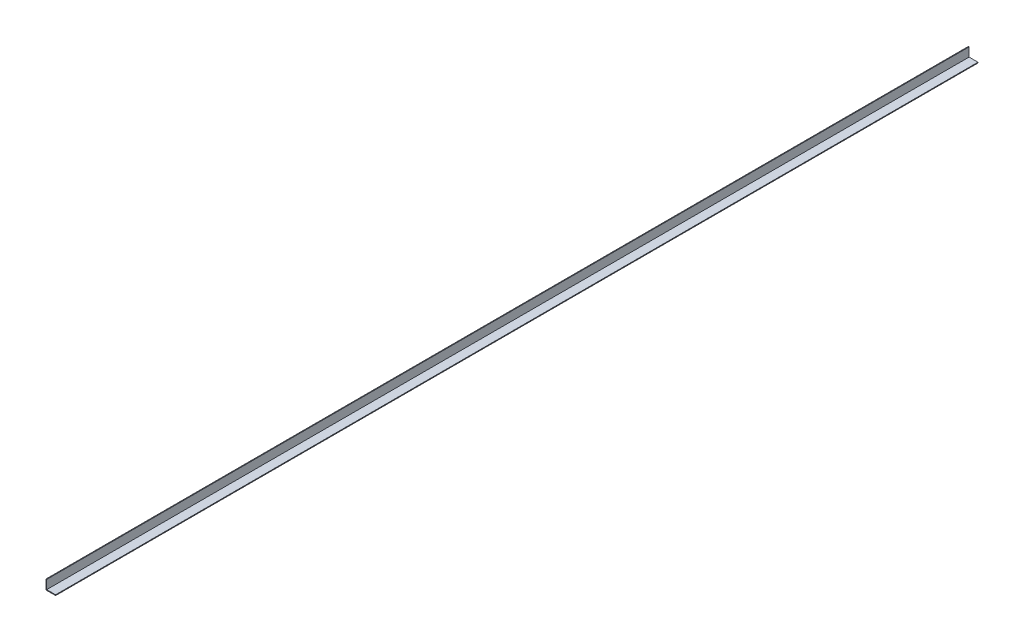
ISO-10303-21;
HEADER;
FILE_DESCRIPTION(('STEP AP214'),'2;1');
FILE_NAME('part.step','',(''),(''),'','','');
FILE_SCHEMA(('AUTOMOTIVE_DESIGN { 1 0 10303 214 1 1 1 1 }'));
ENDSEC;
DATA;
#1=APPLICATION_CONTEXT('core data for automotive mechanical design processes');
#2=APPLICATION_PROTOCOL_DEFINITION('international standard','automotive_design',2000,#1);
#3=PRODUCT_CONTEXT('',#1,'mechanical');
#4=PRODUCT('Part','Part','',(#3));
#5=PRODUCT_RELATED_PRODUCT_CATEGORY('part','',(#4));
#6=PRODUCT_DEFINITION_FORMATION('','',#4);
#7=PRODUCT_DEFINITION_CONTEXT('part definition',#1,'design');
#8=PRODUCT_DEFINITION('design','',#6,#7);
#9=PRODUCT_DEFINITION_SHAPE('','',#8);
#10=(LENGTH_UNIT() NAMED_UNIT(*) SI_UNIT(.MILLI.,.METRE.));
#11=(NAMED_UNIT(*) PLANE_ANGLE_UNIT() SI_UNIT($,.RADIAN.));
#12=(NAMED_UNIT(*) SI_UNIT($,.STERADIAN.) SOLID_ANGLE_UNIT());
#13=UNCERTAINTY_MEASURE_WITH_UNIT(LENGTH_MEASURE(1.E-05),#10,'distance_accuracy_value','');
#14=(GEOMETRIC_REPRESENTATION_CONTEXT(3) GLOBAL_UNCERTAINTY_ASSIGNED_CONTEXT((#13)) GLOBAL_UNIT_ASSIGNED_CONTEXT((#10,
#11,#12)) REPRESENTATION_CONTEXT('',''));
#15=CARTESIAN_POINT('',(0.,0.,0.));
#16=DIRECTION('',(0.,0.,1.));
#17=DIRECTION('',(1.,0.,0.));
#18=AXIS2_PLACEMENT_3D('',#15,#16,#17);
#19=CARTESIAN_POINT('',(4.76,63.5,-6100.));
#20=DIRECTION('',(0.,1.,0.));
#21=DIRECTION('',(0.,0.,1.));
#22=AXIS2_PLACEMENT_3D('',#19,#20,#21);
#23=PLANE('',#22);
#24=DIRECTION('',(-1.,0.,0.));
#25=VECTOR('',#24,1.);
#26=CARTESIAN_POINT('',(4.76,63.5,0.));
#27=LINE('',#26,#25);
#28=CARTESIAN_POINT('',(4.76,63.5,0.));
#29=VERTEX_POINT('',#28);
#30=CARTESIAN_POINT('',(0.,63.5,0.));
#31=VERTEX_POINT('',#30);
#32=EDGE_CURVE('E118',#29,#31,#27,.T.);
#33=ORIENTED_EDGE('',*,*,#32,.F.);
#34=DIRECTION('',(0.,0.,1.));
#35=VECTOR('',#34,1.);
#36=CARTESIAN_POINT('',(4.76,63.5,-6100.));
#37=LINE('',#36,#35);
#38=CARTESIAN_POINT('',(4.76,63.5,-6100.));
#39=VERTEX_POINT('',#38);
#40=EDGE_CURVE('E11',#39,#29,#37,.T.);
#41=ORIENTED_EDGE('',*,*,#40,.F.);
#42=DIRECTION('',(-1.,0.,0.));
#43=VECTOR('',#42,1.);
#44=CARTESIAN_POINT('',(4.76,63.5,-6100.));
#45=LINE('',#44,#43);
#46=CARTESIAN_POINT('',(0.,63.5,-6100.));
#47=VERTEX_POINT('',#46);
#48=EDGE_CURVE('E132',#39,#47,#45,.T.);
#49=ORIENTED_EDGE('',*,*,#48,.T.);
#50=DIRECTION('',(0.,0.,1.));
#51=VECTOR('',#50,1.);
#52=CARTESIAN_POINT('',(0.,63.5,-6100.));
#53=LINE('',#52,#51);
#54=EDGE_CURVE('E36',#47,#31,#53,.T.);
#55=ORIENTED_EDGE('',*,*,#54,.T.);
#56=EDGE_LOOP('',(#33,#41,#49,#55));
#57=FACE_BOUND('',#56,.T.);
#58=ADVANCED_FACE('F33',(#57),#23,.T.);
#59=CARTESIAN_POINT('',(4.76,4.76,-6100.));
#60=DIRECTION('',(1.,0.,0.));
#61=DIRECTION('',(0.,1.,0.));
#62=AXIS2_PLACEMENT_3D('',#59,#60,#61);
#63=PLANE('',#62);
#64=DIRECTION('',(0.,1.,0.));
#65=VECTOR('',#64,1.);
#66=CARTESIAN_POINT('',(4.76,4.76,0.));
#67=LINE('',#66,#65);
#68=CARTESIAN_POINT('',(4.76,4.76,0.));
#69=VERTEX_POINT('',#68);
#70=EDGE_CURVE('E130',#69,#29,#67,.T.);
#71=ORIENTED_EDGE('',*,*,#70,.F.);
#72=DIRECTION('',(0.,0.,1.));
#73=VECTOR('',#72,1.);
#74=CARTESIAN_POINT('',(4.76,4.76,-6100.));
#75=LINE('',#74,#73);
#76=CARTESIAN_POINT('',(4.76,4.76,-6100.));
#77=VERTEX_POINT('',#76);
#78=EDGE_CURVE('E42',#77,#69,#75,.T.);
#79=ORIENTED_EDGE('',*,*,#78,.F.);
#80=DIRECTION('',(0.,1.,0.));
#81=VECTOR('',#80,1.);
#82=CARTESIAN_POINT('',(4.76,4.76,-6100.));
#83=LINE('',#82,#81);
#84=EDGE_CURVE('E108',#77,#39,#83,.T.);
#85=ORIENTED_EDGE('',*,*,#84,.T.);
#86=ORIENTED_EDGE('',*,*,#40,.T.);
#87=EDGE_LOOP('',(#71,#79,#85,#86));
#88=FACE_BOUND('',#87,.T.);
#89=ADVANCED_FACE('F140',(#88),#63,.T.);
#90=CARTESIAN_POINT('',(63.5,4.76,-6100.));
#91=DIRECTION('',(0.,1.,0.));
#92=DIRECTION('',(-1.,0.,0.));
#93=AXIS2_PLACEMENT_3D('',#90,#91,#92);
#94=PLANE('',#93);
#95=DIRECTION('',(-1.,0.,0.));
#96=VECTOR('',#95,1.);
#97=CARTESIAN_POINT('',(63.5,4.76,0.));
#98=LINE('',#97,#96);
#99=CARTESIAN_POINT('',(63.5,4.76,0.));
#100=VERTEX_POINT('',#99);
#101=EDGE_CURVE('E95',#100,#69,#98,.T.);
#102=ORIENTED_EDGE('',*,*,#101,.F.);
#103=DIRECTION('',(0.,0.,1.));
#104=VECTOR('',#103,1.);
#105=CARTESIAN_POINT('',(63.5,4.76,-6100.));
#106=LINE('',#105,#104);
#107=CARTESIAN_POINT('',(63.5,4.76,-6100.));
#108=VERTEX_POINT('',#107);
#109=EDGE_CURVE('E90',#108,#100,#106,.T.);
#110=ORIENTED_EDGE('',*,*,#109,.F.);
#111=DIRECTION('',(-1.,0.,0.));
#112=VECTOR('',#111,1.);
#113=CARTESIAN_POINT('',(63.5,4.76,-6100.));
#114=LINE('',#113,#112);
#115=EDGE_CURVE('E93',#108,#77,#114,.T.);
#116=ORIENTED_EDGE('',*,*,#115,.T.);
#117=ORIENTED_EDGE('',*,*,#78,.T.);
#118=EDGE_LOOP('',(#102,#110,#116,#117));
#119=FACE_BOUND('',#118,.T.);
#120=ADVANCED_FACE('F92',(#119),#94,.T.);
#121=CARTESIAN_POINT('',(63.5,0.,-6100.));
#122=DIRECTION('',(1.,0.,0.));
#123=DIRECTION('',(0.,0.,-1.));
#124=AXIS2_PLACEMENT_3D('',#121,#122,#123);
#125=PLANE('',#124);
#126=DIRECTION('',(0.,1.,0.));
#127=VECTOR('',#126,1.);
#128=CARTESIAN_POINT('',(63.5,0.,0.));
#129=LINE('',#128,#127);
#130=CARTESIAN_POINT('',(63.5,0.,0.));
#131=VERTEX_POINT('',#130);
#132=EDGE_CURVE('E127',#131,#100,#129,.T.);
#133=ORIENTED_EDGE('',*,*,#132,.F.);
#134=DIRECTION('',(0.,0.,1.));
#135=VECTOR('',#134,1.);
#136=CARTESIAN_POINT('',(63.5,0.,-6100.));
#137=LINE('',#136,#135);
#138=CARTESIAN_POINT('',(63.5,0.,-6100.));
#139=VERTEX_POINT('',#138);
#140=EDGE_CURVE('E100',#139,#131,#137,.T.);
#141=ORIENTED_EDGE('',*,*,#140,.F.);
#142=DIRECTION('',(0.,1.,0.));
#143=VECTOR('',#142,1.);
#144=CARTESIAN_POINT('',(63.5,0.,-6100.));
#145=LINE('',#144,#143);
#146=EDGE_CURVE('E106',#139,#108,#145,.T.);
#147=ORIENTED_EDGE('',*,*,#146,.T.);
#148=ORIENTED_EDGE('',*,*,#109,.T.);
#149=EDGE_LOOP('',(#133,#141,#147,#148));
#150=FACE_BOUND('',#149,.T.);
#151=ADVANCED_FACE('F110',(#150),#125,.T.);
#152=CARTESIAN_POINT('',(0.,0.,-6100.));
#153=DIRECTION('',(0.,-1.,0.));
#154=DIRECTION('',(0.,0.,-1.));
#155=AXIS2_PLACEMENT_3D('',#152,#153,#154);
#156=PLANE('',#155);
#157=DIRECTION('',(1.,0.,0.));
#158=VECTOR('',#157,1.);
#159=CARTESIAN_POINT('',(0.,0.,0.));
#160=LINE('',#159,#158);
#161=CARTESIAN_POINT('',(0.,0.,0.));
#162=VERTEX_POINT('',#161);
#163=EDGE_CURVE('E124',#162,#131,#160,.T.);
#164=ORIENTED_EDGE('',*,*,#163,.F.);
#165=DIRECTION('',(0.,0.,1.));
#166=VECTOR('',#165,1.);
#167=CARTESIAN_POINT('',(0.,0.,-6100.));
#168=LINE('',#167,#166);
#169=CARTESIAN_POINT('',(0.,0.,-6100.));
#170=VERTEX_POINT('',#169);
#171=EDGE_CURVE('E135',#170,#162,#168,.T.);
#172=ORIENTED_EDGE('',*,*,#171,.F.);
#173=DIRECTION('',(1.,0.,0.));
#174=VECTOR('',#173,1.);
#175=CARTESIAN_POINT('',(0.,0.,-6100.));
#176=LINE('',#175,#174);
#177=EDGE_CURVE('E111',#170,#139,#176,.T.);
#178=ORIENTED_EDGE('',*,*,#177,.T.);
#179=ORIENTED_EDGE('',*,*,#140,.T.);
#180=EDGE_LOOP('',(#164,#172,#178,#179));
#181=FACE_BOUND('',#180,.T.);
#182=ADVANCED_FACE('F153',(#181),#156,.T.);
#183=CARTESIAN_POINT('',(0.,63.5,-6100.));
#184=DIRECTION('',(-1.,0.,0.));
#185=DIRECTION('',(0.,-1.,0.));
#186=AXIS2_PLACEMENT_3D('',#183,#184,#185);
#187=PLANE('',#186);
#188=DIRECTION('',(0.,-1.,0.));
#189=VECTOR('',#188,1.);
#190=CARTESIAN_POINT('',(0.,63.5,0.));
#191=LINE('',#190,#189);
#192=EDGE_CURVE('E121',#31,#162,#191,.T.);
#193=ORIENTED_EDGE('',*,*,#192,.F.);
#194=ORIENTED_EDGE('',*,*,#54,.F.);
#195=DIRECTION('',(0.,-1.,0.));
#196=VECTOR('',#195,1.);
#197=CARTESIAN_POINT('',(0.,63.5,-6100.));
#198=LINE('',#197,#196);
#199=EDGE_CURVE('E113',#47,#170,#198,.T.);
#200=ORIENTED_EDGE('',*,*,#199,.T.);
#201=ORIENTED_EDGE('',*,*,#171,.T.);
#202=EDGE_LOOP('',(#193,#194,#200,#201));
#203=FACE_BOUND('',#202,.T.);
#204=ADVANCED_FACE('F137',(#203),#187,.T.);
#205=CARTESIAN_POINT('',(0.,0.,-6100.));
#206=DIRECTION('',(0.,0.,1.));
#207=DIRECTION('',(1.,0.,0.));
#208=AXIS2_PLACEMENT_3D('',#205,#206,#207);
#209=PLANE('',#208);
#210=ORIENTED_EDGE('',*,*,#48,.F.);
#211=ORIENTED_EDGE('',*,*,#84,.F.);
#212=ORIENTED_EDGE('',*,*,#115,.F.);
#213=ORIENTED_EDGE('',*,*,#146,.F.);
#214=ORIENTED_EDGE('',*,*,#177,.F.);
#215=ORIENTED_EDGE('',*,*,#199,.F.);
#216=EDGE_LOOP('',(#210,#211,#212,#213,#214,#215));
#217=FACE_BOUND('',#216,.T.);
#218=ADVANCED_FACE('F104',(#217),#209,.F.);
#219=CARTESIAN_POINT('',(0.,0.,0.));
#220=DIRECTION('',(0.,0.,1.));
#221=DIRECTION('',(1.,0.,0.));
#222=AXIS2_PLACEMENT_3D('',#219,#220,#221);
#223=PLANE('',#222);
#224=ORIENTED_EDGE('',*,*,#32,.T.);
#225=ORIENTED_EDGE('',*,*,#192,.T.);
#226=ORIENTED_EDGE('',*,*,#163,.T.);
#227=ORIENTED_EDGE('',*,*,#132,.T.);
#228=ORIENTED_EDGE('',*,*,#101,.T.);
#229=ORIENTED_EDGE('',*,*,#70,.T.);
#230=EDGE_LOOP('',(#224,#225,#226,#227,#228,#229));
#231=FACE_BOUND('',#230,.T.);
#232=ADVANCED_FACE('F139',(#231),#223,.T.);
#233=CLOSED_SHELL('',(#58,#89,#120,#151,#182,#204,#218,#232));
#234=MANIFOLD_SOLID_BREP('B2',#233);
#235=ADVANCED_BREP_SHAPE_REPRESENTATION('',(#18,#234),#14);
#236=SHAPE_DEFINITION_REPRESENTATION(#9,#235);
ENDSEC;
END-ISO-10303-21;
